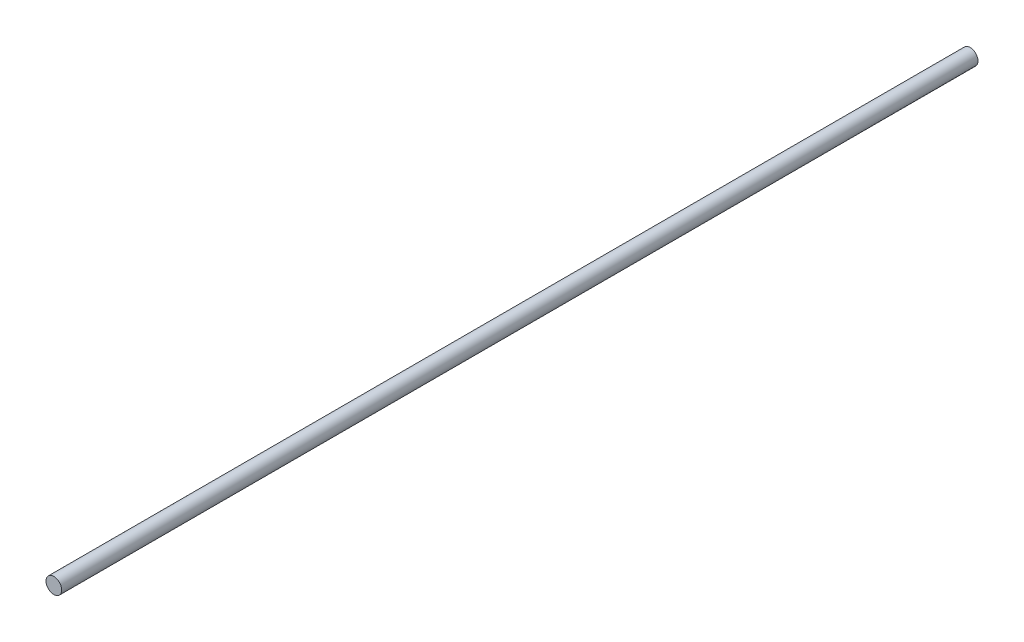
ISO-10303-21;
HEADER;
FILE_DESCRIPTION(('STEP AP214'),'2;1');
FILE_NAME('part.step','',(''),(''),'','','');
FILE_SCHEMA(('AUTOMOTIVE_DESIGN { 1 0 10303 214 1 1 1 1 }'));
ENDSEC;
DATA;
#1=APPLICATION_CONTEXT('core data for automotive mechanical design processes');
#2=APPLICATION_PROTOCOL_DEFINITION('international standard','automotive_design',2000,#1);
#3=PRODUCT_CONTEXT('',#1,'mechanical');
#4=PRODUCT('Part','Part','',(#3));
#5=PRODUCT_RELATED_PRODUCT_CATEGORY('part','',(#4));
#6=PRODUCT_DEFINITION_FORMATION('','',#4);
#7=PRODUCT_DEFINITION_CONTEXT('part definition',#1,'design');
#8=PRODUCT_DEFINITION('design','',#6,#7);
#9=PRODUCT_DEFINITION_SHAPE('','',#8);
#10=(LENGTH_UNIT() NAMED_UNIT(*) SI_UNIT(.MILLI.,.METRE.));
#11=(NAMED_UNIT(*) PLANE_ANGLE_UNIT() SI_UNIT($,.RADIAN.));
#12=(NAMED_UNIT(*) SI_UNIT($,.STERADIAN.) SOLID_ANGLE_UNIT());
#13=UNCERTAINTY_MEASURE_WITH_UNIT(LENGTH_MEASURE(1.E-05),#10,'distance_accuracy_value','');
#14=(GEOMETRIC_REPRESENTATION_CONTEXT(3) GLOBAL_UNCERTAINTY_ASSIGNED_CONTEXT((#13)) GLOBAL_UNIT_ASSIGNED_CONTEXT((#10,
#11,#12)) REPRESENTATION_CONTEXT('',''));
#15=CARTESIAN_POINT('',(0.,0.,0.));
#16=DIRECTION('',(0.,0.,1.));
#17=DIRECTION('',(1.,0.,0.));
#18=AXIS2_PLACEMENT_3D('',#15,#16,#17);
#19=CARTESIAN_POINT('',(0.,0.,350.));
#20=DIRECTION('',(0.,0.,-1.));
#21=DIRECTION('',(-1.,0.,0.));
#22=AXIS2_PLACEMENT_3D('',#19,#20,#21);
#23=CYLINDRICAL_SURFACE('',#22,3.);
#24=CARTESIAN_POINT('',(0.,0.,350.));
#25=DIRECTION('',(0.,0.,1.));
#26=DIRECTION('',(1.,0.,0.));
#27=AXIS2_PLACEMENT_3D('',#24,#25,#26);
#28=CIRCLE('',#27,3.);
#29=CARTESIAN_POINT('',(3.,0.,350.));
#30=VERTEX_POINT('',#29);
#31=EDGE_CURVE('E10',#30,#30,#28,.T.);
#32=ORIENTED_EDGE('',*,*,#31,.F.);
#33=EDGE_LOOP('',(#32));
#34=FACE_BOUND('',#33,.T.);
#35=CARTESIAN_POINT('',(0.,0.,0.));
#36=DIRECTION('',(0.,0.,1.));
#37=DIRECTION('',(1.,0.,0.));
#38=AXIS2_PLACEMENT_3D('',#35,#36,#37);
#39=CIRCLE('',#38,3.);
#40=CARTESIAN_POINT('',(3.,0.,0.));
#41=VERTEX_POINT('',#40);
#42=EDGE_CURVE('E32',#41,#41,#39,.T.);
#43=ORIENTED_EDGE('',*,*,#42,.T.);
#44=EDGE_LOOP('',(#43));
#45=FACE_BOUND('',#44,.T.);
#46=ADVANCED_FACE('F29',(#34,#45),#23,.T.);
#47=CARTESIAN_POINT('',(0.,0.,350.));
#48=DIRECTION('',(0.,0.,1.));
#49=DIRECTION('',(1.,0.,0.));
#50=AXIS2_PLACEMENT_3D('',#47,#48,#49);
#51=PLANE('',#50);
#52=ORIENTED_EDGE('',*,*,#31,.T.);
#53=EDGE_LOOP('',(#52));
#54=FACE_BOUND('',#53,.T.);
#55=ADVANCED_FACE('F44',(#54),#51,.T.);
#56=CARTESIAN_POINT('',(0.,0.,0.));
#57=DIRECTION('',(0.,0.,1.));
#58=DIRECTION('',(1.,0.,0.));
#59=AXIS2_PLACEMENT_3D('',#56,#57,#58);
#60=PLANE('',#59);
#61=ORIENTED_EDGE('',*,*,#42,.F.);
#62=EDGE_LOOP('',(#61));
#63=FACE_BOUND('',#62,.T.);
#64=ADVANCED_FACE('F42',(#63),#60,.F.);
#65=CLOSED_SHELL('',(#46,#55,#64));
#66=MANIFOLD_SOLID_BREP('B2',#65);
#67=ADVANCED_BREP_SHAPE_REPRESENTATION('',(#18,#66),#14);
#68=SHAPE_DEFINITION_REPRESENTATION(#9,#67);
ENDSEC;
END-ISO-10303-21;
